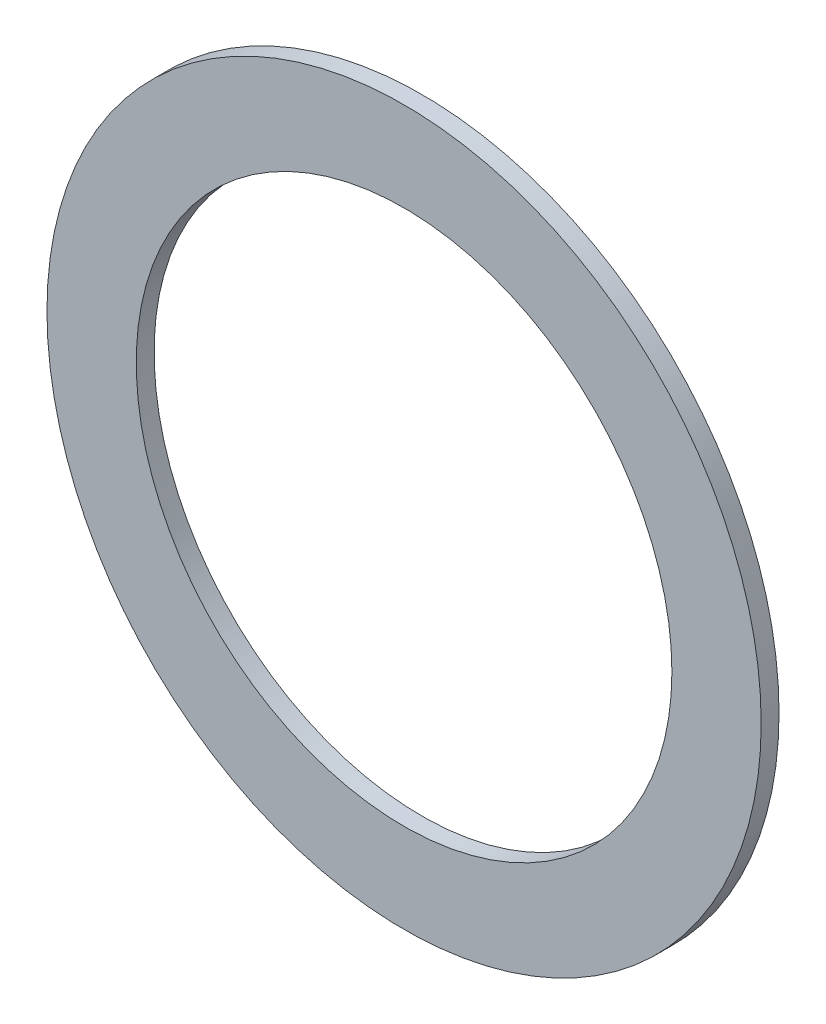
ISO-10303-21;
HEADER;
FILE_DESCRIPTION(('STEP AP214'),'2;1');
FILE_NAME('part.step','',(''),(''),'','','');
FILE_SCHEMA(('AUTOMOTIVE_DESIGN { 1 0 10303 214 1 1 1 1 }'));
ENDSEC;
DATA;
#1=APPLICATION_CONTEXT('core data for automotive mechanical design processes');
#2=APPLICATION_PROTOCOL_DEFINITION('international standard','automotive_design',2000,#1);
#3=PRODUCT_CONTEXT('',#1,'mechanical');
#4=PRODUCT('Part','Part','',(#3));
#5=PRODUCT_RELATED_PRODUCT_CATEGORY('part','',(#4));
#6=PRODUCT_DEFINITION_FORMATION('','',#4);
#7=PRODUCT_DEFINITION_CONTEXT('part definition',#1,'design');
#8=PRODUCT_DEFINITION('design','',#6,#7);
#9=PRODUCT_DEFINITION_SHAPE('','',#8);
#10=(LENGTH_UNIT() NAMED_UNIT(*) SI_UNIT(.MILLI.,.METRE.));
#11=(NAMED_UNIT(*) PLANE_ANGLE_UNIT() SI_UNIT($,.RADIAN.));
#12=(NAMED_UNIT(*) SI_UNIT($,.STERADIAN.) SOLID_ANGLE_UNIT());
#13=UNCERTAINTY_MEASURE_WITH_UNIT(LENGTH_MEASURE(1.E-05),#10,'distance_accuracy_value','');
#14=(GEOMETRIC_REPRESENTATION_CONTEXT(3) GLOBAL_UNCERTAINTY_ASSIGNED_CONTEXT((#13)) GLOBAL_UNIT_ASSIGNED_CONTEXT((#10,
#11,#12)) REPRESENTATION_CONTEXT('',''));
#15=CARTESIAN_POINT('',(0.,0.,0.));
#16=DIRECTION('',(0.,0.,1.));
#17=DIRECTION('',(1.,0.,0.));
#18=AXIS2_PLACEMENT_3D('',#15,#16,#17);
#19=CARTESIAN_POINT('',(0.,0.,-1.));
#20=DIRECTION('',(0.,0.,1.));
#21=DIRECTION('',(1.,0.,0.));
#22=AXIS2_PLACEMENT_3D('',#19,#20,#21);
#23=PLANE('',#22);
#24=CARTESIAN_POINT('',(0.,0.,-1.));
#25=DIRECTION('',(0.,0.,1.));
#26=DIRECTION('',(1.,0.,0.));
#27=AXIS2_PLACEMENT_3D('',#24,#25,#26);
#28=CIRCLE('',#27,3.);
#29=CARTESIAN_POINT('',(3.,0.,-1.));
#30=VERTEX_POINT('',#29);
#31=EDGE_CURVE('E26',#30,#30,#28,.T.);
#32=ORIENTED_EDGE('',*,*,#31,.T.);
#33=EDGE_LOOP('',(#32));
#34=FACE_BOUND('',#33,.T.);
#35=CARTESIAN_POINT('',(0.,0.,-1.));
#36=DIRECTION('',(0.,0.,1.));
#37=DIRECTION('',(1.,0.,0.));
#38=AXIS2_PLACEMENT_3D('',#35,#36,#37);
#39=CIRCLE('',#38,4.);
#40=CARTESIAN_POINT('',(4.,0.,-1.));
#41=VERTEX_POINT('',#40);
#42=EDGE_CURVE('E17',#41,#41,#39,.T.);
#43=ORIENTED_EDGE('',*,*,#42,.F.);
#44=EDGE_LOOP('',(#43));
#45=FACE_BOUND('',#44,.T.);
#46=ADVANCED_FACE('F14',(#34,#45),#23,.F.);
#47=CARTESIAN_POINT('',(0.,0.,-1.));
#48=DIRECTION('',(0.,0.,1.));
#49=DIRECTION('',(1.,0.,0.));
#50=AXIS2_PLACEMENT_3D('',#47,#48,#49);
#51=CYLINDRICAL_SURFACE('',#50,4.);
#52=ORIENTED_EDGE('',*,*,#42,.T.);
#53=EDGE_LOOP('',(#52));
#54=FACE_BOUND('',#53,.T.);
#55=CARTESIAN_POINT('',(0.,0.,-0.8));
#56=DIRECTION('',(0.,0.,1.));
#57=DIRECTION('',(1.,0.,0.));
#58=AXIS2_PLACEMENT_3D('',#55,#56,#57);
#59=CIRCLE('',#58,4.);
#60=CARTESIAN_POINT('',(4.,0.,-0.8));
#61=VERTEX_POINT('',#60);
#62=EDGE_CURVE('E21',#61,#61,#59,.T.);
#63=ORIENTED_EDGE('',*,*,#62,.F.);
#64=EDGE_LOOP('',(#63));
#65=FACE_BOUND('',#64,.T.);
#66=ADVANCED_FACE('F34',(#54,#65),#51,.T.);
#67=CARTESIAN_POINT('',(0.,0.,-1.));
#68=DIRECTION('',(0.,0.,1.));
#69=DIRECTION('',(1.,0.,0.));
#70=AXIS2_PLACEMENT_3D('',#67,#68,#69);
#71=CYLINDRICAL_SURFACE('',#70,3.);
#72=ORIENTED_EDGE('',*,*,#31,.F.);
#73=EDGE_LOOP('',(#72));
#74=FACE_BOUND('',#73,.T.);
#75=CARTESIAN_POINT('',(0.,0.,-0.8));
#76=DIRECTION('',(0.,0.,1.));
#77=DIRECTION('',(1.,0.,0.));
#78=AXIS2_PLACEMENT_3D('',#75,#76,#77);
#79=CIRCLE('',#78,3.);
#80=CARTESIAN_POINT('',(3.,0.,-0.8));
#81=VERTEX_POINT('',#80);
#82=EDGE_CURVE('E9',#81,#81,#79,.F.);
#83=ORIENTED_EDGE('',*,*,#82,.F.);
#84=EDGE_LOOP('',(#83));
#85=FACE_BOUND('',#84,.T.);
#86=ADVANCED_FACE('F42',(#74,#85),#71,.F.);
#87=CARTESIAN_POINT('',(0.,0.,-0.8));
#88=DIRECTION('',(0.,0.,1.));
#89=DIRECTION('',(1.,0.,0.));
#90=AXIS2_PLACEMENT_3D('',#87,#88,#89);
#91=PLANE('',#90);
#92=ORIENTED_EDGE('',*,*,#82,.T.);
#93=EDGE_LOOP('',(#92));
#94=FACE_BOUND('',#93,.T.);
#95=ORIENTED_EDGE('',*,*,#62,.T.);
#96=EDGE_LOOP('',(#95));
#97=FACE_BOUND('',#96,.T.);
#98=ADVANCED_FACE('F43',(#94,#97),#91,.T.);
#99=CLOSED_SHELL('',(#46,#66,#86,#98));
#100=MANIFOLD_SOLID_BREP('B1',#99);
#101=ADVANCED_BREP_SHAPE_REPRESENTATION('',(#18,#100),#14);
#102=SHAPE_DEFINITION_REPRESENTATION(#9,#101);
ENDSEC;
END-ISO-10303-21;
